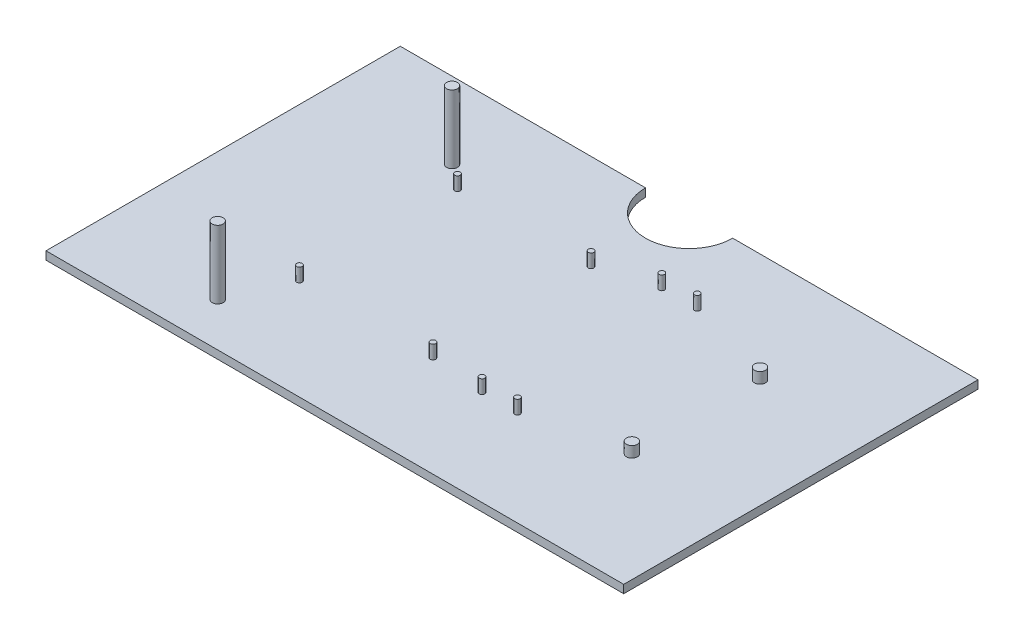
ISO-10303-21;
HEADER;
FILE_DESCRIPTION(('STEP AP214'),'2;1');
FILE_NAME('part.step','',(''),(''),'','','');
FILE_SCHEMA(('AUTOMOTIVE_DESIGN { 1 0 10303 214 1 1 1 1 }'));
ENDSEC;
DATA;
#1=APPLICATION_CONTEXT('core data for automotive mechanical design processes');
#2=APPLICATION_PROTOCOL_DEFINITION('international standard','automotive_design',2000,#1);
#3=PRODUCT_CONTEXT('',#1,'mechanical');
#4=PRODUCT('Part','Part','',(#3));
#5=PRODUCT_RELATED_PRODUCT_CATEGORY('part','',(#4));
#6=PRODUCT_DEFINITION_FORMATION('','',#4);
#7=PRODUCT_DEFINITION_CONTEXT('part definition',#1,'design');
#8=PRODUCT_DEFINITION('design','',#6,#7);
#9=PRODUCT_DEFINITION_SHAPE('','',#8);
#10=(LENGTH_UNIT() NAMED_UNIT(*) SI_UNIT(.MILLI.,.METRE.));
#11=(NAMED_UNIT(*) PLANE_ANGLE_UNIT() SI_UNIT($,.RADIAN.));
#12=(NAMED_UNIT(*) SI_UNIT($,.STERADIAN.) SOLID_ANGLE_UNIT());
#13=UNCERTAINTY_MEASURE_WITH_UNIT(LENGTH_MEASURE(1.E-05),#10,'distance_accuracy_value','');
#14=(GEOMETRIC_REPRESENTATION_CONTEXT(3) GLOBAL_UNCERTAINTY_ASSIGNED_CONTEXT((#13)) GLOBAL_UNIT_ASSIGNED_CONTEXT((#10,
#11,#12)) REPRESENTATION_CONTEXT('',''));
#15=CARTESIAN_POINT('',(0.,0.,0.));
#16=DIRECTION('',(0.,0.,1.));
#17=DIRECTION('',(1.,0.,0.));
#18=AXIS2_PLACEMENT_3D('',#15,#16,#17);
#19=CARTESIAN_POINT('',(106.,3.,-65.));
#20=DIRECTION('',(0.,0.,1.));
#21=DIRECTION('',(1.,0.,0.));
#22=AXIS2_PLACEMENT_3D('',#19,#20,#21);
#23=PLANE('',#22);
#24=DIRECTION('',(-1.,0.,0.));
#25=VECTOR('',#24,1.);
#26=CARTESIAN_POINT('',(106.,0.,-65.));
#27=LINE('',#26,#25);
#28=CARTESIAN_POINT('',(106.,0.,-65.));
#29=VERTEX_POINT('',#28);
#30=CARTESIAN_POINT('',(16.,0.,-65.));
#31=VERTEX_POINT('',#30);
#32=EDGE_CURVE('E114',#29,#31,#27,.T.);
#33=ORIENTED_EDGE('',*,*,#32,.T.);
#34=DIRECTION('',(0.,1.,0.));
#35=VECTOR('',#34,1.);
#36=CARTESIAN_POINT('',(16.,-7.,-65.));
#37=LINE('',#36,#35);
#38=CARTESIAN_POINT('',(16.,3.,-65.));
#39=VERTEX_POINT('',#38);
#40=EDGE_CURVE('E60',#31,#39,#37,.T.);
#41=ORIENTED_EDGE('',*,*,#40,.T.);
#42=DIRECTION('',(-1.,0.,0.));
#43=VECTOR('',#42,1.);
#44=CARTESIAN_POINT('',(106.,3.,-65.));
#45=LINE('',#44,#43);
#46=CARTESIAN_POINT('',(106.,3.,-65.));
#47=VERTEX_POINT('',#46);
#48=EDGE_CURVE('E112',#47,#39,#45,.T.);
#49=ORIENTED_EDGE('',*,*,#48,.F.);
#50=DIRECTION('',(0.,-1.,0.));
#51=VECTOR('',#50,1.);
#52=CARTESIAN_POINT('',(106.,3.,-65.));
#53=LINE('',#52,#51);
#54=EDGE_CURVE('E129',#47,#29,#53,.T.);
#55=ORIENTED_EDGE('',*,*,#54,.T.);
#56=EDGE_LOOP('',(#33,#41,#49,#55));
#57=FACE_BOUND('',#56,.T.);
#58=ADVANCED_FACE('F45',(#57),#23,.F.);
#59=CARTESIAN_POINT('',(-16.,3.,-65.));
#60=VERTEX_POINT('',#59);
#61=CARTESIAN_POINT('',(-106.,3.,-65.));
#62=VERTEX_POINT('',#61);
#63=EDGE_CURVE('E96',#60,#62,#45,.T.);
#64=ORIENTED_EDGE('',*,*,#63,.F.);
#65=DIRECTION('',(0.,1.,0.));
#66=VECTOR('',#65,1.);
#67=CARTESIAN_POINT('',(-16.,-7.,-65.));
#68=LINE('',#67,#66);
#69=CARTESIAN_POINT('',(-16.,0.,-65.));
#70=VERTEX_POINT('',#69);
#71=EDGE_CURVE('E107',#60,#70,#68,.F.);
#72=ORIENTED_EDGE('',*,*,#71,.T.);
#73=CARTESIAN_POINT('',(-106.,0.,-65.));
#74=VERTEX_POINT('',#73);
#75=EDGE_CURVE('E132',#70,#74,#27,.T.);
#76=ORIENTED_EDGE('',*,*,#75,.T.);
#77=DIRECTION('',(0.,-1.,0.));
#78=VECTOR('',#77,1.);
#79=CARTESIAN_POINT('',(-106.,3.,-65.));
#80=LINE('',#79,#78);
#81=EDGE_CURVE('E53',#62,#74,#80,.T.);
#82=ORIENTED_EDGE('',*,*,#81,.F.);
#83=EDGE_LOOP('',(#64,#72,#76,#82));
#84=FACE_BOUND('',#83,.T.);
#85=ADVANCED_FACE('F47',(#84),#23,.F.);
#86=CARTESIAN_POINT('',(-106.,3.,-65.));
#87=DIRECTION('',(1.,0.,0.));
#88=DIRECTION('',(0.,0.,-1.));
#89=AXIS2_PLACEMENT_3D('',#86,#87,#88);
#90=PLANE('',#89);
#91=DIRECTION('',(0.,0.,1.));
#92=VECTOR('',#91,1.);
#93=CARTESIAN_POINT('',(-106.,0.,-65.));
#94=LINE('',#93,#92);
#95=CARTESIAN_POINT('',(-106.,0.,65.));
#96=VERTEX_POINT('',#95);
#97=EDGE_CURVE('E131',#74,#96,#94,.T.);
#98=ORIENTED_EDGE('',*,*,#97,.T.);
#99=DIRECTION('',(0.,-1.,0.));
#100=VECTOR('',#99,1.);
#101=CARTESIAN_POINT('',(-106.,3.,65.));
#102=LINE('',#101,#100);
#103=CARTESIAN_POINT('',(-106.,3.,65.));
#104=VERTEX_POINT('',#103);
#105=EDGE_CURVE('E140',#104,#96,#102,.T.);
#106=ORIENTED_EDGE('',*,*,#105,.F.);
#107=DIRECTION('',(0.,0.,1.));
#108=VECTOR('',#107,1.);
#109=CARTESIAN_POINT('',(-106.,3.,-65.));
#110=LINE('',#109,#108);
#111=EDGE_CURVE('E119',#62,#104,#110,.T.);
#112=ORIENTED_EDGE('',*,*,#111,.F.);
#113=ORIENTED_EDGE('',*,*,#81,.T.);
#114=EDGE_LOOP('',(#98,#106,#112,#113));
#115=FACE_BOUND('',#114,.T.);
#116=ADVANCED_FACE('F145',(#115),#90,.F.);
#117=CARTESIAN_POINT('',(-106.,3.,65.));
#118=DIRECTION('',(0.,0.,-1.));
#119=DIRECTION('',(-1.,0.,0.));
#120=AXIS2_PLACEMENT_3D('',#117,#118,#119);
#121=PLANE('',#120);
#122=DIRECTION('',(1.,0.,0.));
#123=VECTOR('',#122,1.);
#124=CARTESIAN_POINT('',(-106.,0.,65.));
#125=LINE('',#124,#123);
#126=CARTESIAN_POINT('',(106.,0.,65.));
#127=VERTEX_POINT('',#126);
#128=EDGE_CURVE('E134',#96,#127,#125,.T.);
#129=ORIENTED_EDGE('',*,*,#128,.T.);
#130=DIRECTION('',(0.,-1.,0.));
#131=VECTOR('',#130,1.);
#132=CARTESIAN_POINT('',(106.,3.,65.));
#133=LINE('',#132,#131);
#134=CARTESIAN_POINT('',(106.,3.,65.));
#135=VERTEX_POINT('',#134);
#136=EDGE_CURVE('E138',#135,#127,#133,.T.);
#137=ORIENTED_EDGE('',*,*,#136,.F.);
#138=DIRECTION('',(1.,0.,0.));
#139=VECTOR('',#138,1.);
#140=CARTESIAN_POINT('',(-106.,3.,65.));
#141=LINE('',#140,#139);
#142=EDGE_CURVE('E121',#104,#135,#141,.T.);
#143=ORIENTED_EDGE('',*,*,#142,.F.);
#144=ORIENTED_EDGE('',*,*,#105,.T.);
#145=EDGE_LOOP('',(#129,#137,#143,#144));
#146=FACE_BOUND('',#145,.T.);
#147=ADVANCED_FACE('F156',(#146),#121,.F.);
#148=CARTESIAN_POINT('',(106.,3.,65.));
#149=DIRECTION('',(-1.,0.,0.));
#150=DIRECTION('',(0.,0.,1.));
#151=AXIS2_PLACEMENT_3D('',#148,#149,#150);
#152=PLANE('',#151);
#153=DIRECTION('',(0.,0.,-1.));
#154=VECTOR('',#153,1.);
#155=CARTESIAN_POINT('',(106.,0.,65.));
#156=LINE('',#155,#154);
#157=EDGE_CURVE('E89',#127,#29,#156,.T.);
#158=ORIENTED_EDGE('',*,*,#157,.T.);
#159=ORIENTED_EDGE('',*,*,#54,.F.);
#160=DIRECTION('',(0.,0.,-1.));
#161=VECTOR('',#160,1.);
#162=CARTESIAN_POINT('',(106.,3.,65.));
#163=LINE('',#162,#161);
#164=EDGE_CURVE('E68',#135,#47,#163,.T.);
#165=ORIENTED_EDGE('',*,*,#164,.F.);
#166=ORIENTED_EDGE('',*,*,#136,.T.);
#167=EDGE_LOOP('',(#158,#159,#165,#166));
#168=FACE_BOUND('',#167,.T.);
#169=ADVANCED_FACE('F158',(#168),#152,.F.);
#170=CARTESIAN_POINT('',(0.,3.,0.));
#171=DIRECTION('',(0.,1.,0.));
#172=DIRECTION('',(0.,0.,1.));
#173=AXIS2_PLACEMENT_3D('',#170,#171,#172);
#174=PLANE('',#173);
#175=CARTESIAN_POINT('',(0.,3.,-65.));
#176=DIRECTION('',(0.,1.,0.));
#177=DIRECTION('',(0.,0.,1.));
#178=AXIS2_PLACEMENT_3D('',#175,#176,#177);
#179=CIRCLE('',#178,16.);
#180=EDGE_CURVE('E104',#60,#39,#179,.T.);
#181=ORIENTED_EDGE('',*,*,#180,.F.);
#182=ORIENTED_EDGE('',*,*,#63,.T.);
#183=ORIENTED_EDGE('',*,*,#111,.T.);
#184=ORIENTED_EDGE('',*,*,#142,.T.);
#185=ORIENTED_EDGE('',*,*,#164,.T.);
#186=ORIENTED_EDGE('',*,*,#48,.T.);
#187=EDGE_LOOP('',(#181,#182,#183,#184,#185,#186));
#188=FACE_BOUND('',#187,.T.);
#189=CARTESIAN_POINT('',(19.,3.,30.));
#190=DIRECTION('',(0.,1.,0.));
#191=DIRECTION('',(0.,0.,1.));
#192=AXIS2_PLACEMENT_3D('',#189,#190,#191);
#193=CIRCLE('',#192,1.);
#194=CARTESIAN_POINT('',(19.,3.,31.));
#195=VERTEX_POINT('',#194);
#196=EDGE_CURVE('E457',#195,#195,#193,.T.);
#197=ORIENTED_EDGE('',*,*,#196,.F.);
#198=EDGE_LOOP('',(#197));
#199=FACE_BOUND('',#198,.T.);
#200=CARTESIAN_POINT('',(32.,3.,30.));
#201=DIRECTION('',(0.,1.,0.));
#202=DIRECTION('',(0.,0.,1.));
#203=AXIS2_PLACEMENT_3D('',#200,#201,#202);
#204=CIRCLE('',#203,0.999999999999998);
#205=CARTESIAN_POINT('',(32.,3.,31.));
#206=VERTEX_POINT('',#205);
#207=EDGE_CURVE('E554',#206,#206,#204,.T.);
#208=ORIENTED_EDGE('',*,*,#207,.F.);
#209=EDGE_LOOP('',(#208));
#210=FACE_BOUND('',#209,.T.);
#211=CARTESIAN_POINT('',(32.,3.,-36.));
#212=DIRECTION('',(0.,1.,0.));
#213=DIRECTION('',(0.,0.,1.));
#214=AXIS2_PLACEMENT_3D('',#211,#212,#213);
#215=CIRCLE('',#214,0.999999999999998);
#216=CARTESIAN_POINT('',(32.,3.,-35.));
#217=VERTEX_POINT('',#216);
#218=EDGE_CURVE('E471',#217,#217,#215,.T.);
#219=ORIENTED_EDGE('',*,*,#218,.F.);
#220=EDGE_LOOP('',(#219));
#221=FACE_BOUND('',#220,.T.);
#222=CARTESIAN_POINT('',(19.,3.,-36.));
#223=DIRECTION('',(0.,1.,0.));
#224=DIRECTION('',(0.,0.,1.));
#225=AXIS2_PLACEMENT_3D('',#222,#223,#224);
#226=CIRCLE('',#225,1.);
#227=CARTESIAN_POINT('',(19.,3.,-35.));
#228=VERTEX_POINT('',#227);
#229=EDGE_CURVE('E468',#228,#228,#226,.T.);
#230=ORIENTED_EDGE('',*,*,#229,.F.);
#231=EDGE_LOOP('',(#230));
#232=FACE_BOUND('',#231,.T.);
#233=CARTESIAN_POINT('',(-59.,3.,49.));
#234=DIRECTION('',(0.,1.,0.));
#235=DIRECTION('',(0.,0.,1.));
#236=AXIS2_PLACEMENT_3D('',#233,#234,#235);
#237=CIRCLE('',#236,2.);
#238=CARTESIAN_POINT('',(-59.,3.,51.));
#239=VERTEX_POINT('',#238);
#240=EDGE_CURVE('E476',#239,#239,#237,.T.);
#241=ORIENTED_EDGE('',*,*,#240,.F.);
#242=EDGE_LOOP('',(#241));
#243=FACE_BOUND('',#242,.T.);
#244=CARTESIAN_POINT('',(-59.,3.,-37.));
#245=DIRECTION('',(0.,1.,0.));
#246=DIRECTION('',(0.,0.,1.));
#247=AXIS2_PLACEMENT_3D('',#244,#245,#246);
#248=CIRCLE('',#247,2.);
#249=CARTESIAN_POINT('',(-59.,3.,-35.));
#250=VERTEX_POINT('',#249);
#251=EDGE_CURVE('E479',#250,#250,#248,.T.);
#252=ORIENTED_EDGE('',*,*,#251,.F.);
#253=EDGE_LOOP('',(#252));
#254=FACE_BOUND('',#253,.T.);
#255=CARTESIAN_POINT('',(-50.,3.,28.));
#256=DIRECTION('',(0.,1.,0.));
#257=DIRECTION('',(0.,0.,1.));
#258=AXIS2_PLACEMENT_3D('',#255,#256,#257);
#259=CIRCLE('',#258,0.999999999999998);
#260=CARTESIAN_POINT('',(-50.,3.,29.));
#261=VERTEX_POINT('',#260);
#262=EDGE_CURVE('E497',#261,#261,#259,.T.);
#263=ORIENTED_EDGE('',*,*,#262,.F.);
#264=EDGE_LOOP('',(#263));
#265=FACE_BOUND('',#264,.T.);
#266=CARTESIAN_POINT('',(-0.999999999999987,3.,28.));
#267=DIRECTION('',(0.,1.,0.));
#268=DIRECTION('',(0.,0.,1.));
#269=AXIS2_PLACEMENT_3D('',#266,#267,#268);
#270=CIRCLE('',#269,1.);
#271=CARTESIAN_POINT('',(-0.999999999999987,3.,29.));
#272=VERTEX_POINT('',#271);
#273=EDGE_CURVE('E491',#272,#272,#270,.T.);
#274=ORIENTED_EDGE('',*,*,#273,.F.);
#275=EDGE_LOOP('',(#274));
#276=FACE_BOUND('',#275,.T.);
#277=CARTESIAN_POINT('',(-0.999999999999987,3.,-30.));
#278=DIRECTION('',(0.,1.,0.));
#279=DIRECTION('',(0.,0.,1.));
#280=AXIS2_PLACEMENT_3D('',#277,#278,#279);
#281=CIRCLE('',#280,1.);
#282=CARTESIAN_POINT('',(-0.999999999999987,3.,-29.));
#283=VERTEX_POINT('',#282);
#284=EDGE_CURVE('E484',#283,#283,#281,.T.);
#285=ORIENTED_EDGE('',*,*,#284,.F.);
#286=EDGE_LOOP('',(#285));
#287=FACE_BOUND('',#286,.T.);
#288=CARTESIAN_POINT('',(-50.,3.,-30.));
#289=DIRECTION('',(0.,1.,0.));
#290=DIRECTION('',(0.,0.,1.));
#291=AXIS2_PLACEMENT_3D('',#288,#289,#290);
#292=CIRCLE('',#291,0.999999999999998);
#293=CARTESIAN_POINT('',(-50.,3.,-29.));
#294=VERTEX_POINT('',#293);
#295=EDGE_CURVE('E487',#294,#294,#292,.T.);
#296=ORIENTED_EDGE('',*,*,#295,.F.);
#297=EDGE_LOOP('',(#296));
#298=FACE_BOUND('',#297,.T.);
#299=CARTESIAN_POINT('',(66.,3.,-25.));
#300=DIRECTION('',(0.,1.,0.));
#301=DIRECTION('',(0.,0.,1.));
#302=AXIS2_PLACEMENT_3D('',#299,#300,#301);
#303=CIRCLE('',#302,2.);
#304=CARTESIAN_POINT('',(66.,3.,-23.));
#305=VERTEX_POINT('',#304);
#306=EDGE_CURVE('E509',#305,#305,#303,.T.);
#307=ORIENTED_EDGE('',*,*,#306,.F.);
#308=EDGE_LOOP('',(#307));
#309=FACE_BOUND('',#308,.T.);
#310=CARTESIAN_POINT('',(66.,3.,22.));
#311=DIRECTION('',(0.,1.,0.));
#312=DIRECTION('',(0.,0.,1.));
#313=AXIS2_PLACEMENT_3D('',#310,#311,#312);
#314=CIRCLE('',#313,2.);
#315=CARTESIAN_POINT('',(66.,3.,24.));
#316=VERTEX_POINT('',#315);
#317=EDGE_CURVE('E511',#316,#316,#314,.T.);
#318=ORIENTED_EDGE('',*,*,#317,.F.);
#319=EDGE_LOOP('',(#318));
#320=FACE_BOUND('',#319,.T.);
#321=ADVANCED_FACE('F117',(#188,#199,#210,#221,#232,#243,#254,#265,#276,#287,#298,#309,#320),
#174,.T.);
#322=CARTESIAN_POINT('',(0.,0.,0.));
#323=DIRECTION('',(0.,1.,0.));
#324=DIRECTION('',(0.,0.,1.));
#325=AXIS2_PLACEMENT_3D('',#322,#323,#324);
#326=PLANE('',#325);
#327=ORIENTED_EDGE('',*,*,#75,.F.);
#328=CARTESIAN_POINT('',(0.,0.,-65.));
#329=DIRECTION('',(0.,1.,0.));
#330=DIRECTION('',(0.,0.,1.));
#331=AXIS2_PLACEMENT_3D('',#328,#329,#330);
#332=CIRCLE('',#331,16.);
#333=EDGE_CURVE('E11',#70,#31,#332,.T.);
#334=ORIENTED_EDGE('',*,*,#333,.T.);
#335=ORIENTED_EDGE('',*,*,#32,.F.);
#336=ORIENTED_EDGE('',*,*,#157,.F.);
#337=ORIENTED_EDGE('',*,*,#128,.F.);
#338=ORIENTED_EDGE('',*,*,#97,.F.);
#339=EDGE_LOOP('',(#327,#334,#335,#336,#337,#338));
#340=FACE_BOUND('',#339,.T.);
#341=ADVANCED_FACE('F153',(#340),#326,.F.);
#342=CARTESIAN_POINT('',(66.,7.,22.));
#343=DIRECTION('',(0.,-1.,0.));
#344=DIRECTION('',(0.,0.,-1.));
#345=AXIS2_PLACEMENT_3D('',#342,#343,#344);
#346=CYLINDRICAL_SURFACE('',#345,2.);
#347=CARTESIAN_POINT('',(66.,7.,22.));
#348=DIRECTION('',(0.,1.,0.));
#349=DIRECTION('',(0.,0.,1.));
#350=AXIS2_PLACEMENT_3D('',#347,#348,#349);
#351=CIRCLE('',#350,2.);
#352=CARTESIAN_POINT('',(66.,7.,24.));
#353=VERTEX_POINT('',#352);
#354=EDGE_CURVE('E124',#353,#353,#351,.T.);
#355=ORIENTED_EDGE('',*,*,#354,.F.);
#356=EDGE_LOOP('',(#355));
#357=FACE_BOUND('',#356,.T.);
#358=ORIENTED_EDGE('',*,*,#317,.T.);
#359=EDGE_LOOP('',(#358));
#360=FACE_BOUND('',#359,.T.);
#361=ADVANCED_FACE('F204',(#357,#360),#346,.T.);
#362=CARTESIAN_POINT('',(66.,7.,22.));
#363=DIRECTION('',(0.,1.,0.));
#364=DIRECTION('',(0.,0.,1.));
#365=AXIS2_PLACEMENT_3D('',#362,#363,#364);
#366=PLANE('',#365);
#367=ORIENTED_EDGE('',*,*,#354,.T.);
#368=EDGE_LOOP('',(#367));
#369=FACE_BOUND('',#368,.T.);
#370=ADVANCED_FACE('F212',(#369),#366,.T.);
#371=CARTESIAN_POINT('',(66.,7.,-25.));
#372=DIRECTION('',(0.,-1.,0.));
#373=DIRECTION('',(0.,0.,-1.));
#374=AXIS2_PLACEMENT_3D('',#371,#372,#373);
#375=CYLINDRICAL_SURFACE('',#374,2.);
#376=CARTESIAN_POINT('',(66.,7.,-25.));
#377=DIRECTION('',(0.,1.,0.));
#378=DIRECTION('',(0.,0.,1.));
#379=AXIS2_PLACEMENT_3D('',#376,#377,#378);
#380=CIRCLE('',#379,2.);
#381=CARTESIAN_POINT('',(66.,7.,-23.));
#382=VERTEX_POINT('',#381);
#383=EDGE_CURVE('E151',#382,#382,#380,.T.);
#384=ORIENTED_EDGE('',*,*,#383,.F.);
#385=EDGE_LOOP('',(#384));
#386=FACE_BOUND('',#385,.T.);
#387=ORIENTED_EDGE('',*,*,#306,.T.);
#388=EDGE_LOOP('',(#387));
#389=FACE_BOUND('',#388,.T.);
#390=ADVANCED_FACE('F222',(#386,#389),#375,.T.);
#391=CARTESIAN_POINT('',(66.,7.,-25.));
#392=DIRECTION('',(0.,1.,0.));
#393=DIRECTION('',(0.,0.,1.));
#394=AXIS2_PLACEMENT_3D('',#391,#392,#393);
#395=PLANE('',#394);
#396=ORIENTED_EDGE('',*,*,#383,.T.);
#397=EDGE_LOOP('',(#396));
#398=FACE_BOUND('',#397,.T.);
#399=ADVANCED_FACE('F232',(#398),#395,.T.);
#400=CARTESIAN_POINT('',(-50.,8.,-30.));
#401=DIRECTION('',(0.,-1.,0.));
#402=DIRECTION('',(0.,0.,-1.));
#403=AXIS2_PLACEMENT_3D('',#400,#401,#402);
#404=CYLINDRICAL_SURFACE('',#403,0.999999999999998);
#405=CARTESIAN_POINT('',(-50.,8.,-30.));
#406=DIRECTION('',(0.,1.,0.));
#407=DIRECTION('',(0.,0.,1.));
#408=AXIS2_PLACEMENT_3D('',#405,#406,#407);
#409=CIRCLE('',#408,0.999999999999998);
#410=CARTESIAN_POINT('',(-50.,8.,-29.));
#411=VERTEX_POINT('',#410);
#412=EDGE_CURVE('E502',#411,#411,#409,.T.);
#413=ORIENTED_EDGE('',*,*,#412,.F.);
#414=EDGE_LOOP('',(#413));
#415=FACE_BOUND('',#414,.T.);
#416=ORIENTED_EDGE('',*,*,#295,.T.);
#417=EDGE_LOOP('',(#416));
#418=FACE_BOUND('',#417,.T.);
#419=ADVANCED_FACE('F242',(#415,#418),#404,.T.);
#420=CARTESIAN_POINT('',(-50.,8.,-30.));
#421=DIRECTION('',(0.,1.,0.));
#422=DIRECTION('',(0.,0.,1.));
#423=AXIS2_PLACEMENT_3D('',#420,#421,#422);
#424=PLANE('',#423);
#425=ORIENTED_EDGE('',*,*,#412,.T.);
#426=EDGE_LOOP('',(#425));
#427=FACE_BOUND('',#426,.T.);
#428=ADVANCED_FACE('F252',(#427),#424,.T.);
#429=CARTESIAN_POINT('',(-0.999999999999987,8.,-30.));
#430=DIRECTION('',(0.,-1.,0.));
#431=DIRECTION('',(0.,0.,-1.));
#432=AXIS2_PLACEMENT_3D('',#429,#430,#431);
#433=CYLINDRICAL_SURFACE('',#432,1.);
#434=CARTESIAN_POINT('',(-0.999999999999987,8.,-30.));
#435=DIRECTION('',(0.,1.,0.));
#436=DIRECTION('',(0.,0.,1.));
#437=AXIS2_PLACEMENT_3D('',#434,#435,#436);
#438=CIRCLE('',#437,1.);
#439=CARTESIAN_POINT('',(-0.999999999999987,8.,-29.));
#440=VERTEX_POINT('',#439);
#441=EDGE_CURVE('E488',#440,#440,#438,.T.);
#442=ORIENTED_EDGE('',*,*,#441,.F.);
#443=EDGE_LOOP('',(#442));
#444=FACE_BOUND('',#443,.T.);
#445=ORIENTED_EDGE('',*,*,#284,.T.);
#446=EDGE_LOOP('',(#445));
#447=FACE_BOUND('',#446,.T.);
#448=ADVANCED_FACE('F262',(#444,#447),#433,.T.);
#449=CARTESIAN_POINT('',(-0.999999999999987,8.,-30.));
#450=DIRECTION('',(0.,1.,0.));
#451=DIRECTION('',(0.,0.,1.));
#452=AXIS2_PLACEMENT_3D('',#449,#450,#451);
#453=PLANE('',#452);
#454=ORIENTED_EDGE('',*,*,#441,.T.);
#455=EDGE_LOOP('',(#454));
#456=FACE_BOUND('',#455,.T.);
#457=ADVANCED_FACE('F272',(#456),#453,.T.);
#458=CARTESIAN_POINT('',(-0.999999999999987,8.,28.));
#459=DIRECTION('',(0.,-1.,0.));
#460=DIRECTION('',(0.,0.,-1.));
#461=AXIS2_PLACEMENT_3D('',#458,#459,#460);
#462=CYLINDRICAL_SURFACE('',#461,1.);
#463=CARTESIAN_POINT('',(-0.999999999999987,8.,28.));
#464=DIRECTION('',(0.,1.,0.));
#465=DIRECTION('',(0.,0.,1.));
#466=AXIS2_PLACEMENT_3D('',#463,#464,#465);
#467=CIRCLE('',#466,1.);
#468=CARTESIAN_POINT('',(-0.999999999999987,8.,29.));
#469=VERTEX_POINT('',#468);
#470=EDGE_CURVE('E494',#469,#469,#467,.T.);
#471=ORIENTED_EDGE('',*,*,#470,.F.);
#472=EDGE_LOOP('',(#471));
#473=FACE_BOUND('',#472,.T.);
#474=ORIENTED_EDGE('',*,*,#273,.T.);
#475=EDGE_LOOP('',(#474));
#476=FACE_BOUND('',#475,.T.);
#477=ADVANCED_FACE('F282',(#473,#476),#462,.T.);
#478=CARTESIAN_POINT('',(-0.999999999999987,8.,28.));
#479=DIRECTION('',(0.,1.,0.));
#480=DIRECTION('',(0.,0.,1.));
#481=AXIS2_PLACEMENT_3D('',#478,#479,#480);
#482=PLANE('',#481);
#483=ORIENTED_EDGE('',*,*,#470,.T.);
#484=EDGE_LOOP('',(#483));
#485=FACE_BOUND('',#484,.T.);
#486=ADVANCED_FACE('F292',(#485),#482,.T.);
#487=CARTESIAN_POINT('',(-50.,8.,28.));
#488=DIRECTION('',(0.,-1.,0.));
#489=DIRECTION('',(0.,0.,-1.));
#490=AXIS2_PLACEMENT_3D('',#487,#488,#489);
#491=CYLINDRICAL_SURFACE('',#490,0.999999999999998);
#492=CARTESIAN_POINT('',(-50.,8.,28.));
#493=DIRECTION('',(0.,1.,0.));
#494=DIRECTION('',(0.,0.,1.));
#495=AXIS2_PLACEMENT_3D('',#492,#493,#494);
#496=CIRCLE('',#495,0.999999999999998);
#497=CARTESIAN_POINT('',(-50.,8.,29.));
#498=VERTEX_POINT('',#497);
#499=EDGE_CURVE('E475',#498,#498,#496,.T.);
#500=ORIENTED_EDGE('',*,*,#499,.F.);
#501=EDGE_LOOP('',(#500));
#502=FACE_BOUND('',#501,.T.);
#503=ORIENTED_EDGE('',*,*,#262,.T.);
#504=EDGE_LOOP('',(#503));
#505=FACE_BOUND('',#504,.T.);
#506=ADVANCED_FACE('F302',(#502,#505),#491,.T.);
#507=CARTESIAN_POINT('',(-50.,8.,28.));
#508=DIRECTION('',(0.,1.,0.));
#509=DIRECTION('',(0.,0.,1.));
#510=AXIS2_PLACEMENT_3D('',#507,#508,#509);
#511=PLANE('',#510);
#512=ORIENTED_EDGE('',*,*,#499,.T.);
#513=EDGE_LOOP('',(#512));
#514=FACE_BOUND('',#513,.T.);
#515=ADVANCED_FACE('F312',(#514),#511,.T.);
#516=CARTESIAN_POINT('',(-59.,28.,-37.));
#517=DIRECTION('',(0.,-1.,0.));
#518=DIRECTION('',(0.,0.,-1.));
#519=AXIS2_PLACEMENT_3D('',#516,#517,#518);
#520=CYLINDRICAL_SURFACE('',#519,2.);
#521=CARTESIAN_POINT('',(-59.,28.,-37.));
#522=DIRECTION('',(0.,1.,0.));
#523=DIRECTION('',(0.,0.,1.));
#524=AXIS2_PLACEMENT_3D('',#521,#522,#523);
#525=CIRCLE('',#524,2.);
#526=CARTESIAN_POINT('',(-59.,28.,-35.));
#527=VERTEX_POINT('',#526);
#528=EDGE_CURVE('E467',#527,#527,#525,.T.);
#529=ORIENTED_EDGE('',*,*,#528,.F.);
#530=EDGE_LOOP('',(#529));
#531=FACE_BOUND('',#530,.T.);
#532=ORIENTED_EDGE('',*,*,#251,.T.);
#533=EDGE_LOOP('',(#532));
#534=FACE_BOUND('',#533,.T.);
#535=ADVANCED_FACE('F322',(#531,#534),#520,.T.);
#536=CARTESIAN_POINT('',(-59.,28.,-37.));
#537=DIRECTION('',(0.,1.,0.));
#538=DIRECTION('',(0.,0.,1.));
#539=AXIS2_PLACEMENT_3D('',#536,#537,#538);
#540=PLANE('',#539);
#541=ORIENTED_EDGE('',*,*,#528,.T.);
#542=EDGE_LOOP('',(#541));
#543=FACE_BOUND('',#542,.T.);
#544=ADVANCED_FACE('F332',(#543),#540,.T.);
#545=CARTESIAN_POINT('',(-59.,28.,49.));
#546=DIRECTION('',(0.,-1.,0.));
#547=DIRECTION('',(0.,0.,-1.));
#548=AXIS2_PLACEMENT_3D('',#545,#546,#547);
#549=CYLINDRICAL_SURFACE('',#548,2.);
#550=CARTESIAN_POINT('',(-59.,28.,49.));
#551=DIRECTION('',(0.,1.,0.));
#552=DIRECTION('',(0.,0.,1.));
#553=AXIS2_PLACEMENT_3D('',#550,#551,#552);
#554=CIRCLE('',#553,2.);
#555=CARTESIAN_POINT('',(-59.,28.,51.));
#556=VERTEX_POINT('',#555);
#557=EDGE_CURVE('E472',#556,#556,#554,.T.);
#558=ORIENTED_EDGE('',*,*,#557,.F.);
#559=EDGE_LOOP('',(#558));
#560=FACE_BOUND('',#559,.T.);
#561=ORIENTED_EDGE('',*,*,#240,.T.);
#562=EDGE_LOOP('',(#561));
#563=FACE_BOUND('',#562,.T.);
#564=ADVANCED_FACE('F342',(#560,#563),#549,.T.);
#565=CARTESIAN_POINT('',(-59.,28.,49.));
#566=DIRECTION('',(0.,1.,0.));
#567=DIRECTION('',(0.,0.,1.));
#568=AXIS2_PLACEMENT_3D('',#565,#566,#567);
#569=PLANE('',#568);
#570=ORIENTED_EDGE('',*,*,#557,.T.);
#571=EDGE_LOOP('',(#570));
#572=FACE_BOUND('',#571,.T.);
#573=ADVANCED_FACE('F352',(#572),#569,.T.);
#574=CARTESIAN_POINT('',(19.,8.,-36.));
#575=DIRECTION('',(0.,-1.,0.));
#576=DIRECTION('',(0.,0.,-1.));
#577=AXIS2_PLACEMENT_3D('',#574,#575,#576);
#578=CYLINDRICAL_SURFACE('',#577,1.);
#579=CARTESIAN_POINT('',(19.,8.,-36.));
#580=DIRECTION('',(0.,1.,0.));
#581=DIRECTION('',(0.,0.,1.));
#582=AXIS2_PLACEMENT_3D('',#579,#580,#581);
#583=CIRCLE('',#582,1.);
#584=CARTESIAN_POINT('',(19.,8.,-35.));
#585=VERTEX_POINT('',#584);
#586=EDGE_CURVE('E464',#585,#585,#583,.T.);
#587=ORIENTED_EDGE('',*,*,#586,.F.);
#588=EDGE_LOOP('',(#587));
#589=FACE_BOUND('',#588,.T.);
#590=ORIENTED_EDGE('',*,*,#229,.T.);
#591=EDGE_LOOP('',(#590));
#592=FACE_BOUND('',#591,.T.);
#593=ADVANCED_FACE('F362',(#589,#592),#578,.T.);
#594=CARTESIAN_POINT('',(19.,8.,-36.));
#595=DIRECTION('',(0.,1.,0.));
#596=DIRECTION('',(0.,0.,1.));
#597=AXIS2_PLACEMENT_3D('',#594,#595,#596);
#598=PLANE('',#597);
#599=ORIENTED_EDGE('',*,*,#586,.T.);
#600=EDGE_LOOP('',(#599));
#601=FACE_BOUND('',#600,.T.);
#602=ADVANCED_FACE('F372',(#601),#598,.T.);
#603=CARTESIAN_POINT('',(32.,8.,-36.));
#604=DIRECTION('',(0.,-1.,0.));
#605=DIRECTION('',(0.,0.,-1.));
#606=AXIS2_PLACEMENT_3D('',#603,#604,#605);
#607=CYLINDRICAL_SURFACE('',#606,0.999999999999998);
#608=CARTESIAN_POINT('',(32.,8.,-36.));
#609=DIRECTION('',(0.,1.,0.));
#610=DIRECTION('',(0.,0.,1.));
#611=AXIS2_PLACEMENT_3D('',#608,#609,#610);
#612=CIRCLE('',#611,0.999999999999998);
#613=CARTESIAN_POINT('',(32.,8.,-35.));
#614=VERTEX_POINT('',#613);
#615=EDGE_CURVE('E549',#614,#614,#612,.T.);
#616=ORIENTED_EDGE('',*,*,#615,.F.);
#617=EDGE_LOOP('',(#616));
#618=FACE_BOUND('',#617,.T.);
#619=ORIENTED_EDGE('',*,*,#218,.T.);
#620=EDGE_LOOP('',(#619));
#621=FACE_BOUND('',#620,.T.);
#622=ADVANCED_FACE('F382',(#618,#621),#607,.T.);
#623=CARTESIAN_POINT('',(32.,8.,-36.));
#624=DIRECTION('',(0.,1.,0.));
#625=DIRECTION('',(0.,0.,1.));
#626=AXIS2_PLACEMENT_3D('',#623,#624,#625);
#627=PLANE('',#626);
#628=ORIENTED_EDGE('',*,*,#615,.T.);
#629=EDGE_LOOP('',(#628));
#630=FACE_BOUND('',#629,.T.);
#631=ADVANCED_FACE('F392',(#630),#627,.T.);
#632=CARTESIAN_POINT('',(32.,8.,30.));
#633=DIRECTION('',(0.,-1.,0.));
#634=DIRECTION('',(0.,0.,-1.));
#635=AXIS2_PLACEMENT_3D('',#632,#633,#634);
#636=CYLINDRICAL_SURFACE('',#635,0.999999999999998);
#637=CARTESIAN_POINT('',(32.,8.,30.));
#638=DIRECTION('',(0.,1.,0.));
#639=DIRECTION('',(0.,0.,1.));
#640=AXIS2_PLACEMENT_3D('',#637,#638,#639);
#641=CIRCLE('',#640,0.999999999999998);
#642=CARTESIAN_POINT('',(32.,8.,31.));
#643=VERTEX_POINT('',#642);
#644=EDGE_CURVE('E460',#643,#643,#641,.T.);
#645=ORIENTED_EDGE('',*,*,#644,.F.);
#646=EDGE_LOOP('',(#645));
#647=FACE_BOUND('',#646,.T.);
#648=ORIENTED_EDGE('',*,*,#207,.T.);
#649=EDGE_LOOP('',(#648));
#650=FACE_BOUND('',#649,.T.);
#651=ADVANCED_FACE('F402',(#647,#650),#636,.T.);
#652=CARTESIAN_POINT('',(32.,8.,30.));
#653=DIRECTION('',(0.,1.,0.));
#654=DIRECTION('',(0.,0.,1.));
#655=AXIS2_PLACEMENT_3D('',#652,#653,#654);
#656=PLANE('',#655);
#657=ORIENTED_EDGE('',*,*,#644,.T.);
#658=EDGE_LOOP('',(#657));
#659=FACE_BOUND('',#658,.T.);
#660=ADVANCED_FACE('F412',(#659),#656,.T.);
#661=CARTESIAN_POINT('',(19.,8.,30.));
#662=DIRECTION('',(0.,-1.,0.));
#663=DIRECTION('',(0.,0.,-1.));
#664=AXIS2_PLACEMENT_3D('',#661,#662,#663);
#665=CYLINDRICAL_SURFACE('',#664,1.);
#666=CARTESIAN_POINT('',(19.,8.,30.));
#667=DIRECTION('',(0.,1.,0.));
#668=DIRECTION('',(0.,0.,1.));
#669=AXIS2_PLACEMENT_3D('',#666,#667,#668);
#670=CIRCLE('',#669,1.);
#671=CARTESIAN_POINT('',(19.,8.,31.));
#672=VERTEX_POINT('',#671);
#673=EDGE_CURVE('E115',#672,#672,#670,.T.);
#674=ORIENTED_EDGE('',*,*,#673,.F.);
#675=EDGE_LOOP('',(#674));
#676=FACE_BOUND('',#675,.T.);
#677=ORIENTED_EDGE('',*,*,#196,.T.);
#678=EDGE_LOOP('',(#677));
#679=FACE_BOUND('',#678,.T.);
#680=ADVANCED_FACE('F422',(#676,#679),#665,.T.);
#681=CARTESIAN_POINT('',(19.,8.,30.));
#682=DIRECTION('',(0.,1.,0.));
#683=DIRECTION('',(0.,0.,1.));
#684=AXIS2_PLACEMENT_3D('',#681,#682,#683);
#685=PLANE('',#684);
#686=ORIENTED_EDGE('',*,*,#673,.T.);
#687=EDGE_LOOP('',(#686));
#688=FACE_BOUND('',#687,.T.);
#689=ADVANCED_FACE('F432',(#688),#685,.T.);
#690=CARTESIAN_POINT('',(0.,-7.,-65.));
#691=DIRECTION('',(0.,1.,0.));
#692=DIRECTION('',(0.,0.,1.));
#693=AXIS2_PLACEMENT_3D('',#690,#691,#692);
#694=CYLINDRICAL_SURFACE('',#693,16.);
#695=ORIENTED_EDGE('',*,*,#333,.F.);
#696=ORIENTED_EDGE('',*,*,#71,.F.);
#697=ORIENTED_EDGE('',*,*,#180,.T.);
#698=ORIENTED_EDGE('',*,*,#40,.F.);
#699=EDGE_LOOP('',(#695,#696,#697,#698));
#700=FACE_BOUND('',#699,.T.);
#701=ADVANCED_FACE('F105',(#700),#694,.F.);
#702=CLOSED_SHELL('',(#58,#85,#116,#147,#169,#321,#341,#361,#370,#390,#399,#419,#428,#448,#457,
#477,#486,#506,#515,#535,#544,#564,#573,#593,#602,#622,#631,#651,#660,#680,#689,#701));
#703=MANIFOLD_SOLID_BREP('B2',#702);
#704=ADVANCED_BREP_SHAPE_REPRESENTATION('',(#18,#703),#14);
#705=SHAPE_DEFINITION_REPRESENTATION(#9,#704);
ENDSEC;
END-ISO-10303-21;
